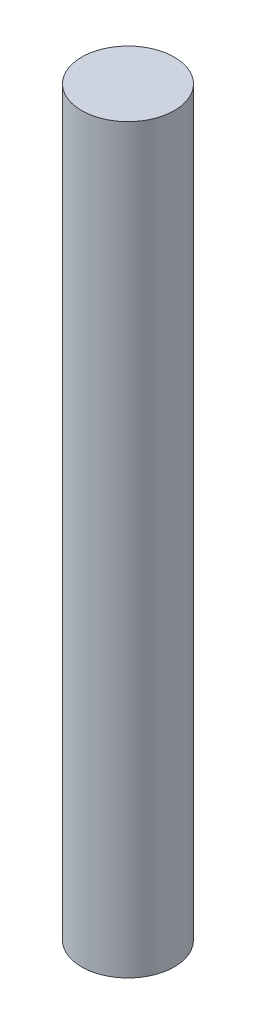
ISO-10303-21;
HEADER;
FILE_DESCRIPTION(('STEP AP214'),'2;1');
FILE_NAME('part.step','',(''),(''),'','','');
FILE_SCHEMA(('AUTOMOTIVE_DESIGN { 1 0 10303 214 1 1 1 1 }'));
ENDSEC;
DATA;
#1=APPLICATION_CONTEXT('core data for automotive mechanical design processes');
#2=APPLICATION_PROTOCOL_DEFINITION('international standard','automotive_design',2000,#1);
#3=PRODUCT_CONTEXT('',#1,'mechanical');
#4=PRODUCT('Part','Part','',(#3));
#5=PRODUCT_RELATED_PRODUCT_CATEGORY('part','',(#4));
#6=PRODUCT_DEFINITION_FORMATION('','',#4);
#7=PRODUCT_DEFINITION_CONTEXT('part definition',#1,'design');
#8=PRODUCT_DEFINITION('design','',#6,#7);
#9=PRODUCT_DEFINITION_SHAPE('','',#8);
#10=(LENGTH_UNIT() NAMED_UNIT(*) SI_UNIT(.MILLI.,.METRE.));
#11=(NAMED_UNIT(*) PLANE_ANGLE_UNIT() SI_UNIT($,.RADIAN.));
#12=(NAMED_UNIT(*) SI_UNIT($,.STERADIAN.) SOLID_ANGLE_UNIT());
#13=UNCERTAINTY_MEASURE_WITH_UNIT(LENGTH_MEASURE(1.E-05),#10,'distance_accuracy_value','');
#14=(GEOMETRIC_REPRESENTATION_CONTEXT(3) GLOBAL_UNCERTAINTY_ASSIGNED_CONTEXT((#13)) GLOBAL_UNIT_ASSIGNED_CONTEXT((#10,
#11,#12)) REPRESENTATION_CONTEXT('',''));
#15=CARTESIAN_POINT('',(0.,0.,0.));
#16=DIRECTION('',(0.,0.,1.));
#17=DIRECTION('',(1.,0.,0.));
#18=AXIS2_PLACEMENT_3D('',#15,#16,#17);
#19=CARTESIAN_POINT('',(0.,20.,0.));
#20=DIRECTION('',(0.,-1.,0.));
#21=DIRECTION('',(0.,0.,-1.));
#22=AXIS2_PLACEMENT_3D('',#19,#20,#21);
#23=CYLINDRICAL_SURFACE('',#22,2.5);
#24=CARTESIAN_POINT('',(0.,20.,0.));
#25=DIRECTION('',(0.,1.,0.));
#26=DIRECTION('',(0.,0.,1.));
#27=AXIS2_PLACEMENT_3D('',#24,#25,#26);
#28=CIRCLE('',#27,2.5);
#29=CARTESIAN_POINT('',(0.,20.,2.5));
#30=VERTEX_POINT('',#29);
#31=EDGE_CURVE('E10',#30,#30,#28,.T.);
#32=ORIENTED_EDGE('',*,*,#31,.F.);
#33=EDGE_LOOP('',(#32));
#34=FACE_BOUND('',#33,.T.);
#35=CARTESIAN_POINT('',(0.,-20.,0.));
#36=DIRECTION('',(0.,1.,0.));
#37=DIRECTION('',(0.,0.,1.));
#38=AXIS2_PLACEMENT_3D('',#35,#36,#37);
#39=CIRCLE('',#38,2.5);
#40=CARTESIAN_POINT('',(0.,-20.,2.5));
#41=VERTEX_POINT('',#40);
#42=EDGE_CURVE('E40',#41,#41,#39,.T.);
#43=ORIENTED_EDGE('',*,*,#42,.T.);
#44=EDGE_LOOP('',(#43));
#45=FACE_BOUND('',#44,.T.);
#46=ADVANCED_FACE('F37',(#34,#45),#23,.T.);
#47=CARTESIAN_POINT('',(0.,20.,0.));
#48=DIRECTION('',(0.,1.,0.));
#49=DIRECTION('',(0.,0.,1.));
#50=AXIS2_PLACEMENT_3D('',#47,#48,#49);
#51=PLANE('',#50);
#52=ORIENTED_EDGE('',*,*,#31,.T.);
#53=EDGE_LOOP('',(#52));
#54=FACE_BOUND('',#53,.T.);
#55=ADVANCED_FACE('F52',(#54),#51,.T.);
#56=CARTESIAN_POINT('',(0.,-20.,0.));
#57=DIRECTION('',(0.,1.,0.));
#58=DIRECTION('',(0.,0.,1.));
#59=AXIS2_PLACEMENT_3D('',#56,#57,#58);
#60=PLANE('',#59);
#61=ORIENTED_EDGE('',*,*,#42,.F.);
#62=EDGE_LOOP('',(#61));
#63=FACE_BOUND('',#62,.T.);
#64=ADVANCED_FACE('F50',(#63),#60,.F.);
#65=CLOSED_SHELL('',(#46,#55,#64));
#66=MANIFOLD_SOLID_BREP('B2',#65);
#67=ADVANCED_BREP_SHAPE_REPRESENTATION('',(#18,#66),#14);
#68=SHAPE_DEFINITION_REPRESENTATION(#9,#67);
ENDSEC;
END-ISO-10303-21;
